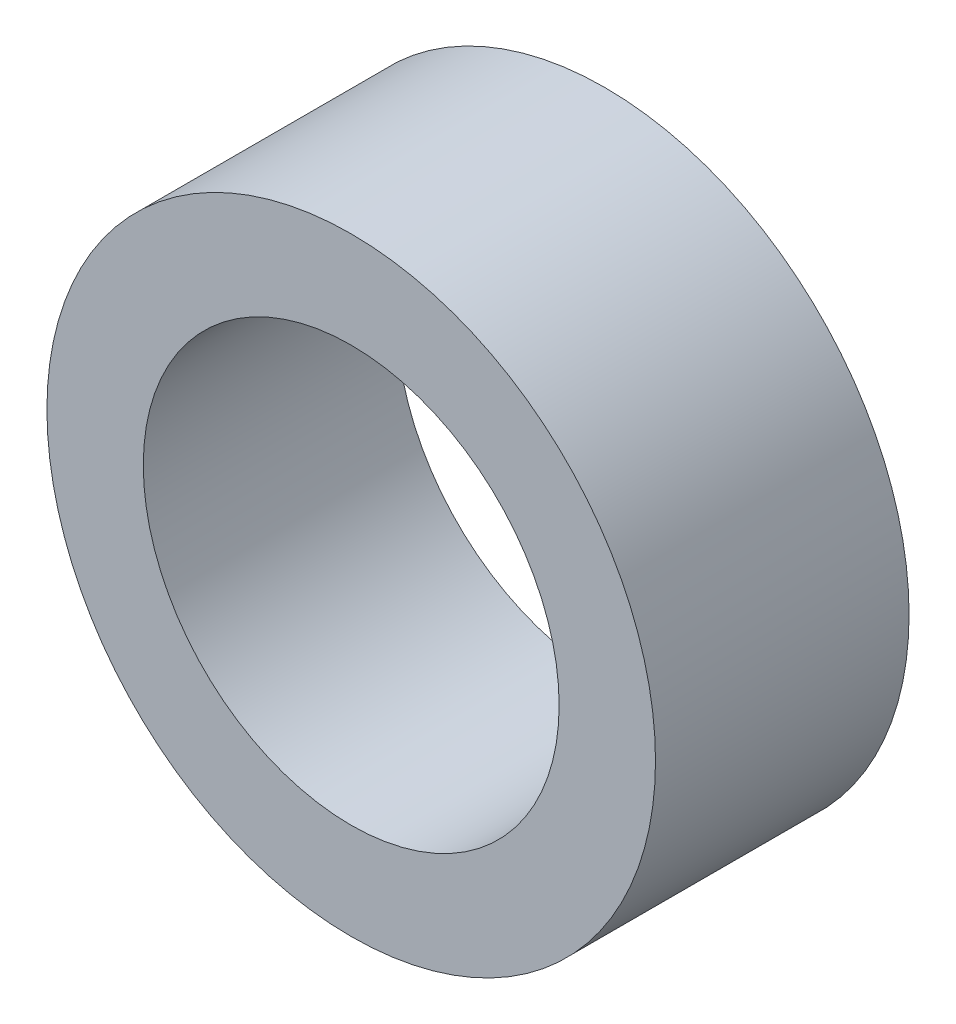
ISO-10303-21;
HEADER;
FILE_DESCRIPTION(('STEP AP214'),'2;1');
FILE_NAME('part.step','',(''),(''),'','','');
FILE_SCHEMA(('AUTOMOTIVE_DESIGN { 1 0 10303 214 1 1 1 1 }'));
ENDSEC;
DATA;
#1=APPLICATION_CONTEXT('core data for automotive mechanical design processes');
#2=APPLICATION_PROTOCOL_DEFINITION('international standard','automotive_design',2000,#1);
#3=PRODUCT_CONTEXT('',#1,'mechanical');
#4=PRODUCT('Part','Part','',(#3));
#5=PRODUCT_RELATED_PRODUCT_CATEGORY('part','',(#4));
#6=PRODUCT_DEFINITION_FORMATION('','',#4);
#7=PRODUCT_DEFINITION_CONTEXT('part definition',#1,'design');
#8=PRODUCT_DEFINITION('design','',#6,#7);
#9=PRODUCT_DEFINITION_SHAPE('','',#8);
#10=(LENGTH_UNIT() NAMED_UNIT(*) SI_UNIT(.MILLI.,.METRE.));
#11=(NAMED_UNIT(*) PLANE_ANGLE_UNIT() SI_UNIT($,.RADIAN.));
#12=(NAMED_UNIT(*) SI_UNIT($,.STERADIAN.) SOLID_ANGLE_UNIT());
#13=UNCERTAINTY_MEASURE_WITH_UNIT(LENGTH_MEASURE(1.E-05),#10,'distance_accuracy_value','');
#14=(GEOMETRIC_REPRESENTATION_CONTEXT(3) GLOBAL_UNCERTAINTY_ASSIGNED_CONTEXT((#13)) GLOBAL_UNIT_ASSIGNED_CONTEXT((#10,
#11,#12)) REPRESENTATION_CONTEXT('',''));
#15=CARTESIAN_POINT('',(0.,0.,0.));
#16=DIRECTION('',(0.,0.,1.));
#17=DIRECTION('',(1.,0.,0.));
#18=AXIS2_PLACEMENT_3D('',#15,#16,#17);
#19=CARTESIAN_POINT('',(0.,0.,5.));
#20=DIRECTION('',(0.,0.,1.));
#21=DIRECTION('',(1.,0.,0.));
#22=AXIS2_PLACEMENT_3D('',#19,#20,#21);
#23=PLANE('',#22);
#24=CARTESIAN_POINT('',(0.,0.,5.));
#25=DIRECTION('',(0.,0.,1.));
#26=DIRECTION('',(1.,0.,0.));
#27=AXIS2_PLACEMENT_3D('',#24,#25,#26);
#28=CIRCLE('',#27,6.);
#29=CARTESIAN_POINT('',(6.,0.,5.));
#30=VERTEX_POINT('',#29);
#31=EDGE_CURVE('E10',#30,#30,#28,.T.);
#32=ORIENTED_EDGE('',*,*,#31,.T.);
#33=EDGE_LOOP('',(#32));
#34=FACE_BOUND('',#33,.T.);
#35=CARTESIAN_POINT('',(0.,0.,5.));
#36=DIRECTION('',(0.,0.,1.));
#37=DIRECTION('',(1.,0.,0.));
#38=AXIS2_PLACEMENT_3D('',#35,#36,#37);
#39=CIRCLE('',#38,4.1);
#40=CARTESIAN_POINT('',(4.1,0.,5.));
#41=VERTEX_POINT('',#40);
#42=EDGE_CURVE('E44',#41,#41,#39,.T.);
#43=ORIENTED_EDGE('',*,*,#42,.F.);
#44=EDGE_LOOP('',(#43));
#45=FACE_BOUND('',#44,.T.);
#46=ADVANCED_FACE('F33',(#34,#45),#23,.T.);
#47=CARTESIAN_POINT('',(0.,0.,0.));
#48=DIRECTION('',(0.,0.,1.));
#49=DIRECTION('',(1.,0.,0.));
#50=AXIS2_PLACEMENT_3D('',#47,#48,#49);
#51=PLANE('',#50);
#52=CARTESIAN_POINT('',(0.,0.,0.));
#53=DIRECTION('',(0.,0.,1.));
#54=DIRECTION('',(1.,0.,0.));
#55=AXIS2_PLACEMENT_3D('',#52,#53,#54);
#56=CIRCLE('',#55,6.);
#57=CARTESIAN_POINT('',(6.,0.,0.));
#58=VERTEX_POINT('',#57);
#59=EDGE_CURVE('E37',#58,#58,#56,.T.);
#60=ORIENTED_EDGE('',*,*,#59,.F.);
#61=EDGE_LOOP('',(#60));
#62=FACE_BOUND('',#61,.T.);
#63=CARTESIAN_POINT('',(0.,0.,0.));
#64=DIRECTION('',(0.,0.,1.));
#65=DIRECTION('',(1.,0.,0.));
#66=AXIS2_PLACEMENT_3D('',#63,#64,#65);
#67=CIRCLE('',#66,4.1);
#68=CARTESIAN_POINT('',(4.1,0.,0.));
#69=VERTEX_POINT('',#68);
#70=EDGE_CURVE('E46',#69,#69,#67,.T.);
#71=ORIENTED_EDGE('',*,*,#70,.T.);
#72=EDGE_LOOP('',(#71));
#73=FACE_BOUND('',#72,.T.);
#74=ADVANCED_FACE('F56',(#62,#73),#51,.F.);
#75=CARTESIAN_POINT('',(0.,0.,5.));
#76=DIRECTION('',(0.,0.,-1.));
#77=DIRECTION('',(-1.,0.,0.));
#78=AXIS2_PLACEMENT_3D('',#75,#76,#77);
#79=CYLINDRICAL_SURFACE('',#78,6.);
#80=ORIENTED_EDGE('',*,*,#31,.F.);
#81=EDGE_LOOP('',(#80));
#82=FACE_BOUND('',#81,.T.);
#83=ORIENTED_EDGE('',*,*,#59,.T.);
#84=EDGE_LOOP('',(#83));
#85=FACE_BOUND('',#84,.T.);
#86=ADVANCED_FACE('F35',(#82,#85),#79,.T.);
#87=CARTESIAN_POINT('',(0.,0.,5.));
#88=DIRECTION('',(0.,0.,-1.));
#89=DIRECTION('',(-1.,0.,0.));
#90=AXIS2_PLACEMENT_3D('',#87,#88,#89);
#91=CYLINDRICAL_SURFACE('',#90,4.1);
#92=ORIENTED_EDGE('',*,*,#42,.T.);
#93=EDGE_LOOP('',(#92));
#94=FACE_BOUND('',#93,.T.);
#95=ORIENTED_EDGE('',*,*,#70,.F.);
#96=EDGE_LOOP('',(#95));
#97=FACE_BOUND('',#96,.T.);
#98=ADVANCED_FACE('F52',(#94,#97),#91,.F.);
#99=CLOSED_SHELL('',(#46,#74,#86,#98));
#100=MANIFOLD_SOLID_BREP('B2',#99);
#101=ADVANCED_BREP_SHAPE_REPRESENTATION('',(#18,#100),#14);
#102=SHAPE_DEFINITION_REPRESENTATION(#9,#101);
ENDSEC;
END-ISO-10303-21;
